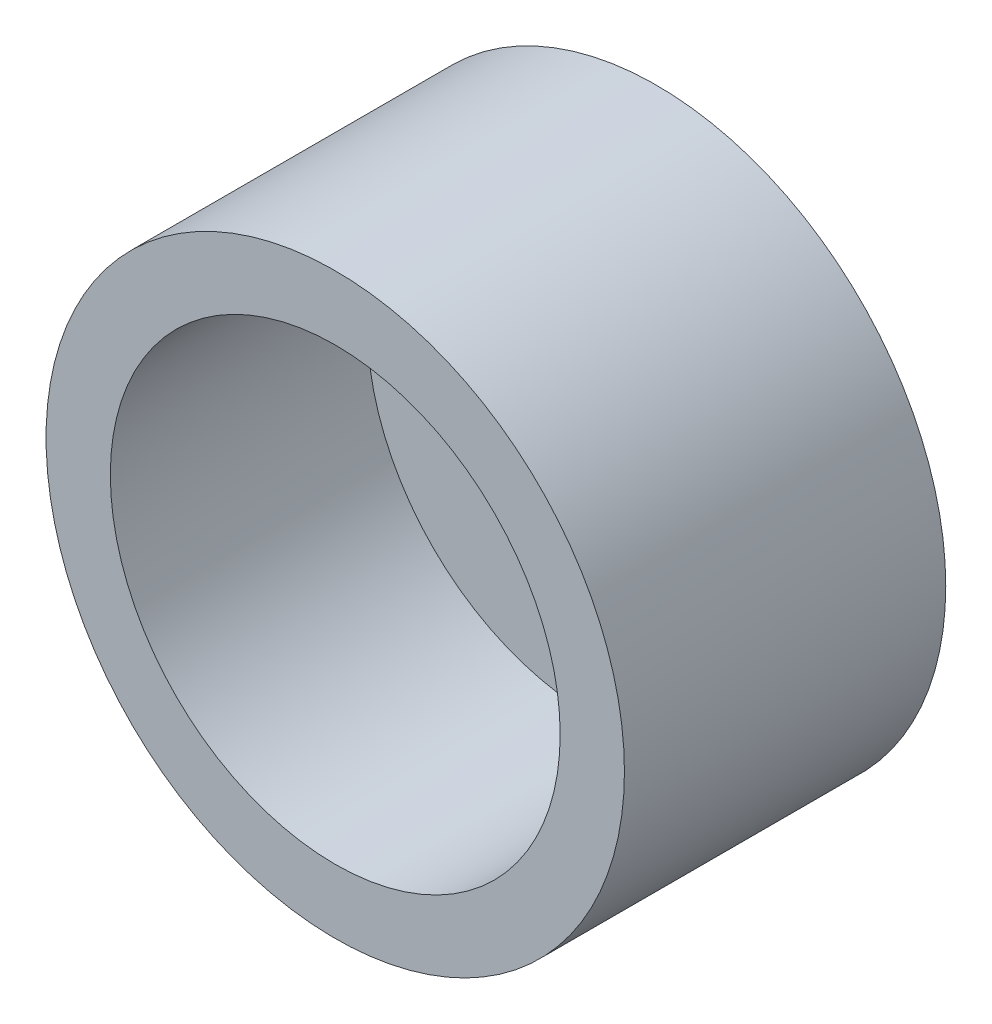
ISO-10303-21;
HEADER;
FILE_DESCRIPTION(('STEP AP214'),'2;1');
FILE_NAME('part.step','',(''),(''),'','','');
FILE_SCHEMA(('AUTOMOTIVE_DESIGN { 1 0 10303 214 1 1 1 1 }'));
ENDSEC;
DATA;
#1=APPLICATION_CONTEXT('core data for automotive mechanical design processes');
#2=APPLICATION_PROTOCOL_DEFINITION('international standard','automotive_design',2000,#1);
#3=PRODUCT_CONTEXT('',#1,'mechanical');
#4=PRODUCT('Part','Part','',(#3));
#5=PRODUCT_RELATED_PRODUCT_CATEGORY('part','',(#4));
#6=PRODUCT_DEFINITION_FORMATION('','',#4);
#7=PRODUCT_DEFINITION_CONTEXT('part definition',#1,'design');
#8=PRODUCT_DEFINITION('design','',#6,#7);
#9=PRODUCT_DEFINITION_SHAPE('','',#8);
#10=(LENGTH_UNIT() NAMED_UNIT(*) SI_UNIT(.MILLI.,.METRE.));
#11=(NAMED_UNIT(*) PLANE_ANGLE_UNIT() SI_UNIT($,.RADIAN.));
#12=(NAMED_UNIT(*) SI_UNIT($,.STERADIAN.) SOLID_ANGLE_UNIT());
#13=UNCERTAINTY_MEASURE_WITH_UNIT(LENGTH_MEASURE(1.E-05),#10,'distance_accuracy_value','');
#14=(GEOMETRIC_REPRESENTATION_CONTEXT(3) GLOBAL_UNCERTAINTY_ASSIGNED_CONTEXT((#13)) GLOBAL_UNIT_ASSIGNED_CONTEXT((#10,
#11,#12)) REPRESENTATION_CONTEXT('',''));
#15=CARTESIAN_POINT('',(0.,0.,0.));
#16=DIRECTION('',(0.,0.,1.));
#17=DIRECTION('',(1.,0.,0.));
#18=AXIS2_PLACEMENT_3D('',#15,#16,#17);
#19=CARTESIAN_POINT('',(0.,0.,10.));
#20=DIRECTION('',(0.,0.,-1.));
#21=DIRECTION('',(-1.,0.,0.));
#22=AXIS2_PLACEMENT_3D('',#19,#20,#21);
#23=CYLINDRICAL_SURFACE('',#22,9.);
#24=CARTESIAN_POINT('',(0.,0.,10.));
#25=DIRECTION('',(0.,0.,1.));
#26=DIRECTION('',(1.,0.,0.));
#27=AXIS2_PLACEMENT_3D('',#24,#25,#26);
#28=CIRCLE('',#27,9.);
#29=CARTESIAN_POINT('',(9.,0.,10.));
#30=VERTEX_POINT('',#29);
#31=EDGE_CURVE('E10',#30,#30,#28,.T.);
#32=ORIENTED_EDGE('',*,*,#31,.F.);
#33=EDGE_LOOP('',(#32));
#34=FACE_BOUND('',#33,.T.);
#35=CARTESIAN_POINT('',(0.,0.,0.));
#36=DIRECTION('',(0.,0.,1.));
#37=DIRECTION('',(1.,0.,0.));
#38=AXIS2_PLACEMENT_3D('',#35,#36,#37);
#39=CIRCLE('',#38,9.);
#40=CARTESIAN_POINT('',(9.,0.,0.));
#41=VERTEX_POINT('',#40);
#42=EDGE_CURVE('E38',#41,#41,#39,.T.);
#43=ORIENTED_EDGE('',*,*,#42,.T.);
#44=EDGE_LOOP('',(#43));
#45=FACE_BOUND('',#44,.T.);
#46=ADVANCED_FACE('F35',(#34,#45),#23,.T.);
#47=CARTESIAN_POINT('',(0.,0.,10.));
#48=DIRECTION('',(0.,0.,1.));
#49=DIRECTION('',(1.,0.,0.));
#50=AXIS2_PLACEMENT_3D('',#47,#48,#49);
#51=PLANE('',#50);
#52=CARTESIAN_POINT('',(0.,0.,10.));
#53=DIRECTION('',(0.,0.,1.));
#54=DIRECTION('',(1.,0.,0.));
#55=AXIS2_PLACEMENT_3D('',#52,#53,#54);
#56=CIRCLE('',#55,7.);
#57=CARTESIAN_POINT('',(7.,0.,10.));
#58=VERTEX_POINT('',#57);
#59=EDGE_CURVE('E45',#58,#58,#56,.T.);
#60=ORIENTED_EDGE('',*,*,#59,.F.);
#61=EDGE_LOOP('',(#60));
#62=FACE_BOUND('',#61,.T.);
#63=ORIENTED_EDGE('',*,*,#31,.T.);
#64=EDGE_LOOP('',(#63));
#65=FACE_BOUND('',#64,.T.);
#66=ADVANCED_FACE('F65',(#62,#65),#51,.T.);
#67=CARTESIAN_POINT('',(0.,0.,0.));
#68=DIRECTION('',(0.,0.,1.));
#69=DIRECTION('',(1.,0.,0.));
#70=AXIS2_PLACEMENT_3D('',#67,#68,#69);
#71=PLANE('',#70);
#72=ORIENTED_EDGE('',*,*,#42,.F.);
#73=EDGE_LOOP('',(#72));
#74=FACE_BOUND('',#73,.T.);
#75=ADVANCED_FACE('F57',(#74),#71,.F.);
#76=CARTESIAN_POINT('',(0.,0.,10.));
#77=DIRECTION('',(0.,0.,-1.));
#78=DIRECTION('',(-1.,0.,0.));
#79=AXIS2_PLACEMENT_3D('',#76,#77,#78);
#80=CYLINDRICAL_SURFACE('',#79,7.);
#81=ORIENTED_EDGE('',*,*,#59,.T.);
#82=EDGE_LOOP('',(#81));
#83=FACE_BOUND('',#82,.T.);
#84=CARTESIAN_POINT('',(0.,0.,2.));
#85=DIRECTION('',(0.,0.,1.));
#86=DIRECTION('',(1.,0.,0.));
#87=AXIS2_PLACEMENT_3D('',#84,#85,#86);
#88=CIRCLE('',#87,7.);
#89=CARTESIAN_POINT('',(7.,0.,2.));
#90=VERTEX_POINT('',#89);
#91=EDGE_CURVE('E49',#90,#90,#88,.T.);
#92=ORIENTED_EDGE('',*,*,#91,.F.);
#93=EDGE_LOOP('',(#92));
#94=FACE_BOUND('',#93,.T.);
#95=ADVANCED_FACE('F55',(#83,#94),#80,.F.);
#96=CARTESIAN_POINT('',(0.,0.,2.));
#97=DIRECTION('',(0.,0.,1.));
#98=DIRECTION('',(1.,0.,0.));
#99=AXIS2_PLACEMENT_3D('',#96,#97,#98);
#100=PLANE('',#99);
#101=ORIENTED_EDGE('',*,*,#91,.T.);
#102=EDGE_LOOP('',(#101));
#103=FACE_BOUND('',#102,.T.);
#104=ADVANCED_FACE('F53',(#103),#100,.T.);
#105=CLOSED_SHELL('',(#46,#66,#75,#95,#104));
#106=MANIFOLD_SOLID_BREP('B2',#105);
#107=ADVANCED_BREP_SHAPE_REPRESENTATION('',(#18,#106),#14);
#108=SHAPE_DEFINITION_REPRESENTATION(#9,#107);
ENDSEC;
END-ISO-10303-21;
